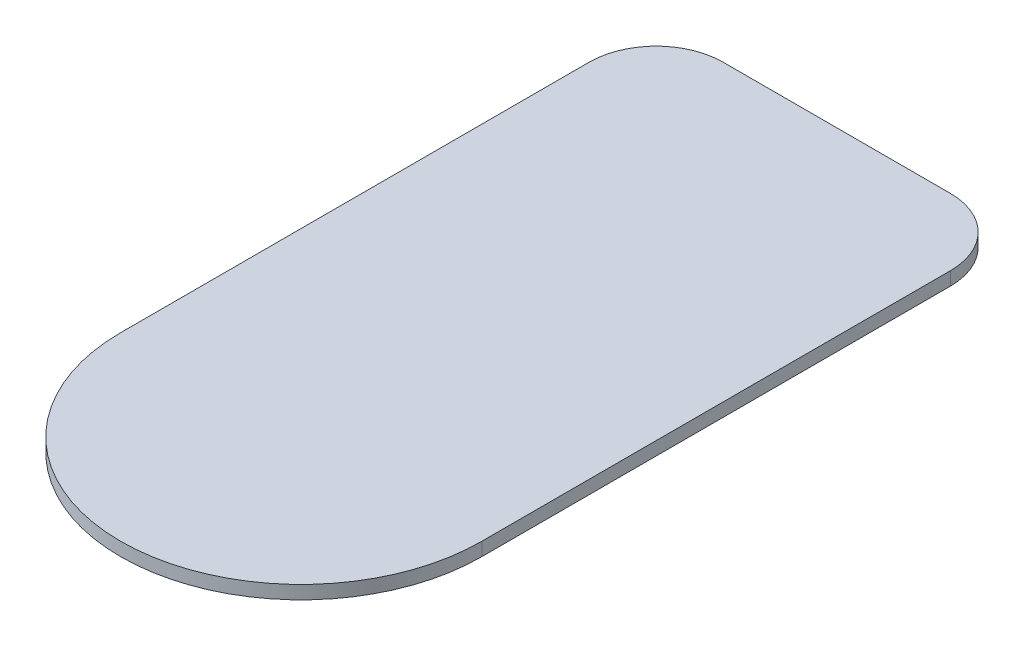
ISO-10303-21;
HEADER;
FILE_DESCRIPTION(('STEP AP214'),'2;1');
FILE_NAME('part.step','',(''),(''),'','','');
FILE_SCHEMA(('AUTOMOTIVE_DESIGN { 1 0 10303 214 1 1 1 1 }'));
ENDSEC;
DATA;
#1=APPLICATION_CONTEXT('core data for automotive mechanical design processes');
#2=APPLICATION_PROTOCOL_DEFINITION('international standard','automotive_design',2000,#1);
#3=PRODUCT_CONTEXT('',#1,'mechanical');
#4=PRODUCT('Part','Part','',(#3));
#5=PRODUCT_RELATED_PRODUCT_CATEGORY('part','',(#4));
#6=PRODUCT_DEFINITION_FORMATION('','',#4);
#7=PRODUCT_DEFINITION_CONTEXT('part definition',#1,'design');
#8=PRODUCT_DEFINITION('design','',#6,#7);
#9=PRODUCT_DEFINITION_SHAPE('','',#8);
#10=(LENGTH_UNIT() NAMED_UNIT(*) SI_UNIT(.MILLI.,.METRE.));
#11=(NAMED_UNIT(*) PLANE_ANGLE_UNIT() SI_UNIT($,.RADIAN.));
#12=(NAMED_UNIT(*) SI_UNIT($,.STERADIAN.) SOLID_ANGLE_UNIT());
#13=UNCERTAINTY_MEASURE_WITH_UNIT(LENGTH_MEASURE(1.E-05),#10,'distance_accuracy_value','');
#14=(GEOMETRIC_REPRESENTATION_CONTEXT(3) GLOBAL_UNCERTAINTY_ASSIGNED_CONTEXT((#13)) GLOBAL_UNIT_ASSIGNED_CONTEXT((#10,
#11,#12)) REPRESENTATION_CONTEXT('',''));
#15=CARTESIAN_POINT('',(0.,0.,0.));
#16=DIRECTION('',(0.,0.,1.));
#17=DIRECTION('',(1.,0.,0.));
#18=AXIS2_PLACEMENT_3D('',#15,#16,#17);
#19=CARTESIAN_POINT('',(-0.01,-239.731657344678,76.4980703111555));
#20=DIRECTION('',(0.,-1.,0.));
#21=DIRECTION('',(0.,0.,-1.));
#22=AXIS2_PLACEMENT_3D('',#19,#20,#21);
#23=PLANE('',#22);
#24=CARTESIAN_POINT('',(0.,-239.731657344678,49.4980703111555));
#25=DIRECTION('',(0.,-1.,0.));
#26=DIRECTION('',(0.,0.,-1.));
#27=AXIS2_PLACEMENT_3D('',#24,#25,#26);
#28=CIRCLE('',#27,27.);
#29=CARTESIAN_POINT('',(27.,-239.731657344678,49.4980703111555));
#30=VERTEX_POINT('',#29);
#31=CARTESIAN_POINT('',(-27.,-239.731657344678,49.4980703111555));
#32=VERTEX_POINT('',#31);
#33=EDGE_CURVE('E44',#30,#32,#28,.T.);
#34=ORIENTED_EDGE('',*,*,#33,.F.);
#35=DIRECTION('',(0.,0.,-1.));
#36=VECTOR('',#35,1.);
#37=CARTESIAN_POINT('',(27.,-239.731657344678,0.));
#38=LINE('',#37,#36);
#39=CARTESIAN_POINT('',(27.,-239.731657344678,-20.5699871703518));
#40=VERTEX_POINT('',#39);
#41=EDGE_CURVE('E49',#30,#40,#38,.T.);
#42=ORIENTED_EDGE('',*,*,#41,.T.);
#43=CARTESIAN_POINT('',(17.,-239.731657344678,-20.5699871703518));
#44=DIRECTION('',(0.,-1.,0.));
#45=DIRECTION('',(0.,0.,-1.));
#46=AXIS2_PLACEMENT_3D('',#43,#44,#45);
#47=CIRCLE('',#46,10.);
#48=CARTESIAN_POINT('',(17.,-239.731657344678,-30.5699871703518));
#49=VERTEX_POINT('',#48);
#50=EDGE_CURVE('E11',#40,#49,#47,.F.);
#51=ORIENTED_EDGE('',*,*,#50,.T.);
#52=DIRECTION('',(1.,0.,0.));
#53=VECTOR('',#52,1.);
#54=CARTESIAN_POINT('',(27.,-239.731657344678,-30.5699871703518));
#55=LINE('',#54,#53);
#56=CARTESIAN_POINT('',(-17.,-239.731657344678,-30.5699871703518));
#57=VERTEX_POINT('',#56);
#58=EDGE_CURVE('E63',#57,#49,#55,.T.);
#59=ORIENTED_EDGE('',*,*,#58,.F.);
#60=CARTESIAN_POINT('',(-17.,-239.731657344678,-20.5699871703518));
#61=DIRECTION('',(0.,1.,0.));
#62=DIRECTION('',(0.,0.,-1.));
#63=AXIS2_PLACEMENT_3D('',#60,#61,#62);
#64=CIRCLE('',#63,10.);
#65=CARTESIAN_POINT('',(-27.,-239.731657344678,-20.5699871703518));
#66=VERTEX_POINT('',#65);
#67=EDGE_CURVE('E108',#66,#57,#64,.F.);
#68=ORIENTED_EDGE('',*,*,#67,.F.);
#69=DIRECTION('',(0.,0.,-1.));
#70=VECTOR('',#69,1.);
#71=CARTESIAN_POINT('',(-27.,-239.731657344678,0.));
#72=LINE('',#71,#70);
#73=EDGE_CURVE('E128',#32,#66,#72,.T.);
#74=ORIENTED_EDGE('',*,*,#73,.F.);
#75=EDGE_LOOP('',(#34,#42,#51,#59,#68,#74));
#76=FACE_BOUND('',#75,.T.);
#77=ADVANCED_FACE('F41',(#76),#23,.F.);
#78=CARTESIAN_POINT('',(27.,-230.731657344678,-30.5699871703518));
#79=DIRECTION('',(0.,0.,1.));
#80=DIRECTION('',(1.,0.,0.));
#81=AXIS2_PLACEMENT_3D('',#78,#79,#80);
#82=PLANE('',#81);
#83=DIRECTION('',(-1.,0.,0.));
#84=VECTOR('',#83,1.);
#85=CARTESIAN_POINT('',(27.,-241.731657344678,-30.5699871703518));
#86=LINE('',#85,#84);
#87=CARTESIAN_POINT('',(17.,-241.731657344678,-30.5699871703518));
#88=VERTEX_POINT('',#87);
#89=CARTESIAN_POINT('',(-17.,-241.731657344678,-30.5699871703518));
#90=VERTEX_POINT('',#89);
#91=EDGE_CURVE('E134',#88,#90,#86,.T.);
#92=ORIENTED_EDGE('',*,*,#91,.T.);
#93=DIRECTION('',(0.,1.,0.));
#94=VECTOR('',#93,1.);
#95=CARTESIAN_POINT('',(-17.,-241.731657344678,-30.5699871703518));
#96=LINE('',#95,#94);
#97=EDGE_CURVE('E121',#57,#90,#96,.F.);
#98=ORIENTED_EDGE('',*,*,#97,.F.);
#99=ORIENTED_EDGE('',*,*,#58,.T.);
#100=DIRECTION('',(0.,1.,0.));
#101=VECTOR('',#100,1.);
#102=CARTESIAN_POINT('',(17.,-241.731657344678,-30.5699871703518));
#103=LINE('',#102,#101);
#104=EDGE_CURVE('E139',#49,#88,#103,.F.);
#105=ORIENTED_EDGE('',*,*,#104,.T.);
#106=EDGE_LOOP('',(#92,#98,#99,#105));
#107=FACE_BOUND('',#106,.T.);
#108=ADVANCED_FACE('F148',(#107),#82,.F.);
#109=CARTESIAN_POINT('',(27.,0.,0.));
#110=DIRECTION('',(1.,0.,0.));
#111=DIRECTION('',(0.,0.,-1.));
#112=AXIS2_PLACEMENT_3D('',#109,#110,#111);
#113=PLANE('',#112);
#114=ORIENTED_EDGE('',*,*,#41,.F.);
#115=DIRECTION('',(0.,1.,0.));
#116=VECTOR('',#115,1.);
#117=CARTESIAN_POINT('',(27.,-241.731657344678,49.4980703111555));
#118=LINE('',#117,#116);
#119=CARTESIAN_POINT('',(27.,-241.731657344678,49.4980703111555));
#120=VERTEX_POINT('',#119);
#121=EDGE_CURVE('E107',#120,#30,#118,.T.);
#122=ORIENTED_EDGE('',*,*,#121,.F.);
#123=DIRECTION('',(0.,0.,-1.));
#124=VECTOR('',#123,1.);
#125=CARTESIAN_POINT('',(27.,-241.731657344678,76.4980703111555));
#126=LINE('',#125,#124);
#127=CARTESIAN_POINT('',(27.,-241.731657344678,-20.5699871703518));
#128=VERTEX_POINT('',#127);
#129=EDGE_CURVE('E103',#120,#128,#126,.T.);
#130=ORIENTED_EDGE('',*,*,#129,.T.);
#131=DIRECTION('',(0.,1.,0.));
#132=VECTOR('',#131,1.);
#133=CARTESIAN_POINT('',(27.,-230.731657344678,-20.5699871703518));
#134=LINE('',#133,#132);
#135=EDGE_CURVE('E136',#128,#40,#134,.T.);
#136=ORIENTED_EDGE('',*,*,#135,.T.);
#137=EDGE_LOOP('',(#114,#122,#130,#136));
#138=FACE_BOUND('',#137,.T.);
#139=ADVANCED_FACE('F145',(#138),#113,.T.);
#140=CARTESIAN_POINT('',(27.,-241.731657344678,76.4980703111555));
#141=DIRECTION('',(0.,1.,0.));
#142=DIRECTION('',(0.,0.,1.));
#143=AXIS2_PLACEMENT_3D('',#140,#141,#142);
#144=PLANE('',#143);
#145=ORIENTED_EDGE('',*,*,#91,.F.);
#146=CARTESIAN_POINT('',(17.,-241.731657344678,-20.5699871703518));
#147=DIRECTION('',(0.,1.,0.));
#148=DIRECTION('',(0.,0.,1.));
#149=AXIS2_PLACEMENT_3D('',#146,#147,#148);
#150=CIRCLE('',#149,10.);
#151=EDGE_CURVE('E141',#88,#128,#150,.F.);
#152=ORIENTED_EDGE('',*,*,#151,.T.);
#153=ORIENTED_EDGE('',*,*,#129,.F.);
#154=CARTESIAN_POINT('',(0.,-241.731657344678,49.4980703111555));
#155=DIRECTION('',(0.,-1.,0.));
#156=DIRECTION('',(0.,0.,-1.));
#157=AXIS2_PLACEMENT_3D('',#154,#155,#156);
#158=CIRCLE('',#157,27.);
#159=CARTESIAN_POINT('',(-27.,-241.731657344678,49.4980703111555));
#160=VERTEX_POINT('',#159);
#161=EDGE_CURVE('E94',#120,#160,#158,.T.);
#162=ORIENTED_EDGE('',*,*,#161,.T.);
#163=DIRECTION('',(0.,0.,-1.));
#164=VECTOR('',#163,1.);
#165=CARTESIAN_POINT('',(-27.,-241.731657344678,76.4980703111555));
#166=LINE('',#165,#164);
#167=CARTESIAN_POINT('',(-27.,-241.731657344678,-20.5699871703518));
#168=VERTEX_POINT('',#167);
#169=EDGE_CURVE('E100',#160,#168,#166,.T.);
#170=ORIENTED_EDGE('',*,*,#169,.T.);
#171=CARTESIAN_POINT('',(-17.,-241.731657344678,-20.5699871703518));
#172=DIRECTION('',(0.,-1.,0.));
#173=DIRECTION('',(0.,0.,1.));
#174=AXIS2_PLACEMENT_3D('',#171,#172,#173);
#175=CIRCLE('',#174,10.);
#176=EDGE_CURVE('E126',#90,#168,#175,.F.);
#177=ORIENTED_EDGE('',*,*,#176,.F.);
#178=EDGE_LOOP('',(#145,#152,#153,#162,#170,#177));
#179=FACE_BOUND('',#178,.T.);
#180=ADVANCED_FACE('F97',(#179),#144,.F.);
#181=CARTESIAN_POINT('',(0.,-241.731657344678,49.4980703111555));
#182=DIRECTION('',(0.,1.,0.));
#183=DIRECTION('',(0.,0.,1.));
#184=AXIS2_PLACEMENT_3D('',#181,#182,#183);
#185=CYLINDRICAL_SURFACE('',#184,27.);
#186=ORIENTED_EDGE('',*,*,#121,.T.);
#187=ORIENTED_EDGE('',*,*,#33,.T.);
#188=DIRECTION('',(0.,1.,0.));
#189=VECTOR('',#188,1.);
#190=CARTESIAN_POINT('',(-27.,-241.731657344678,49.4980703111555));
#191=LINE('',#190,#189);
#192=EDGE_CURVE('E111',#160,#32,#191,.T.);
#193=ORIENTED_EDGE('',*,*,#192,.F.);
#194=ORIENTED_EDGE('',*,*,#161,.F.);
#195=EDGE_LOOP('',(#186,#187,#193,#194));
#196=FACE_BOUND('',#195,.T.);
#197=ADVANCED_FACE('F112',(#196),#185,.T.);
#198=CARTESIAN_POINT('',(17.,0.,-20.5699871703518));
#199=DIRECTION('',(0.,-1.,0.));
#200=DIRECTION('',(0.,0.,-1.));
#201=AXIS2_PLACEMENT_3D('',#198,#199,#200);
#202=CYLINDRICAL_SURFACE('',#201,10.);
#203=ORIENTED_EDGE('',*,*,#50,.F.);
#204=ORIENTED_EDGE('',*,*,#135,.F.);
#205=ORIENTED_EDGE('',*,*,#151,.F.);
#206=ORIENTED_EDGE('',*,*,#104,.F.);
#207=EDGE_LOOP('',(#203,#204,#205,#206));
#208=FACE_BOUND('',#207,.T.);
#209=ADVANCED_FACE('F147',(#208),#202,.T.);
#210=CARTESIAN_POINT('',(-27.,0.,0.));
#211=DIRECTION('',(-1.,0.,0.));
#212=DIRECTION('',(0.,0.,-1.));
#213=AXIS2_PLACEMENT_3D('',#210,#211,#212);
#214=PLANE('',#213);
#215=ORIENTED_EDGE('',*,*,#73,.T.);
#216=DIRECTION('',(0.,1.,0.));
#217=VECTOR('',#216,1.);
#218=CARTESIAN_POINT('',(-27.,-230.731657344678,-20.5699871703518));
#219=LINE('',#218,#217);
#220=EDGE_CURVE('E119',#168,#66,#219,.T.);
#221=ORIENTED_EDGE('',*,*,#220,.F.);
#222=ORIENTED_EDGE('',*,*,#169,.F.);
#223=ORIENTED_EDGE('',*,*,#192,.T.);
#224=EDGE_LOOP('',(#215,#221,#222,#223));
#225=FACE_BOUND('',#224,.T.);
#226=ADVANCED_FACE('F118',(#225),#214,.T.);
#227=CARTESIAN_POINT('',(-17.,0.,-20.5699871703518));
#228=DIRECTION('',(0.,-1.,0.));
#229=DIRECTION('',(0.,0.,-1.));
#230=AXIS2_PLACEMENT_3D('',#227,#228,#229);
#231=CYLINDRICAL_SURFACE('',#230,10.);
#232=ORIENTED_EDGE('',*,*,#67,.T.);
#233=ORIENTED_EDGE('',*,*,#97,.T.);
#234=ORIENTED_EDGE('',*,*,#176,.T.);
#235=ORIENTED_EDGE('',*,*,#220,.T.);
#236=EDGE_LOOP('',(#232,#233,#234,#235));
#237=FACE_BOUND('',#236,.T.);
#238=ADVANCED_FACE('F151',(#237),#231,.T.);
#239=CLOSED_SHELL('',(#77,#108,#139,#180,#197,#209,#226,#238));
#240=MANIFOLD_SOLID_BREP('B2',#239);
#241=ADVANCED_BREP_SHAPE_REPRESENTATION('',(#18,#240),#14);
#242=SHAPE_DEFINITION_REPRESENTATION(#9,#241);
ENDSEC;
END-ISO-10303-21;
